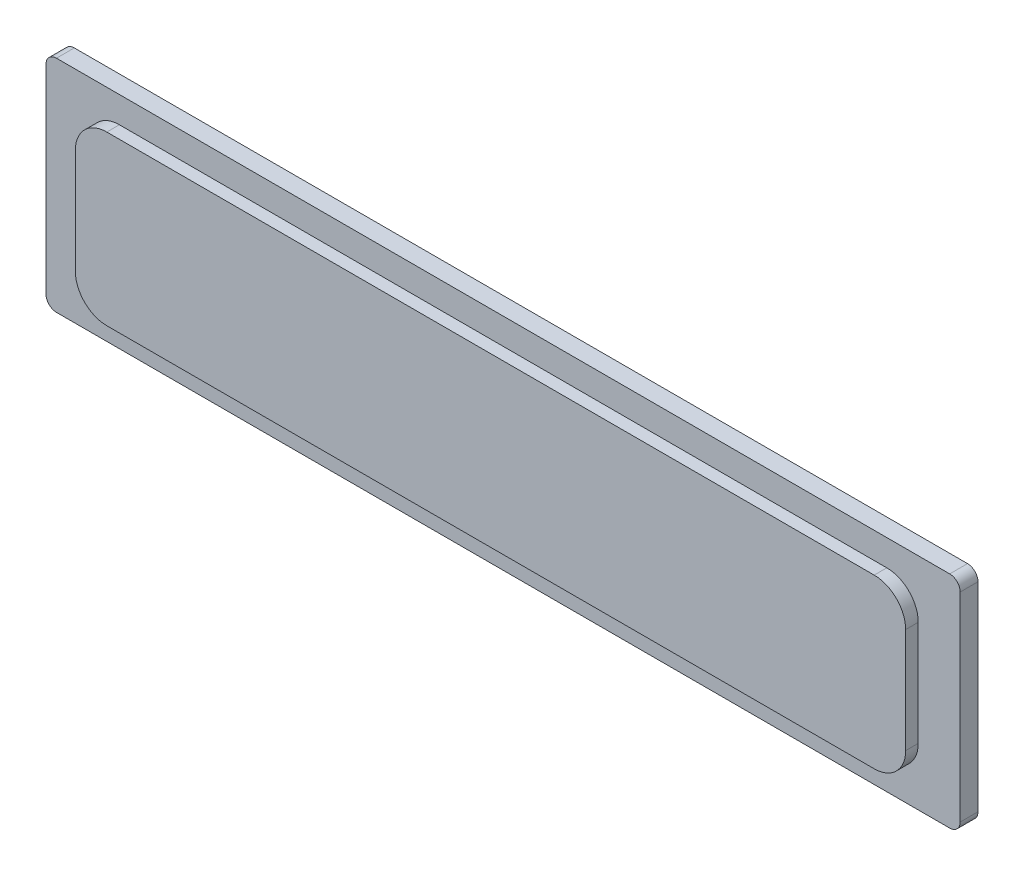
ISO-10303-21;
HEADER;
FILE_DESCRIPTION(('STEP AP214'),'2;1');
FILE_NAME('part.step','',(''),(''),'','','');
FILE_SCHEMA(('AUTOMOTIVE_DESIGN { 1 0 10303 214 1 1 1 1 }'));
ENDSEC;
DATA;
#1=APPLICATION_CONTEXT('core data for automotive mechanical design processes');
#2=APPLICATION_PROTOCOL_DEFINITION('international standard','automotive_design',2000,#1);
#3=PRODUCT_CONTEXT('',#1,'mechanical');
#4=PRODUCT('Part','Part','',(#3));
#5=PRODUCT_RELATED_PRODUCT_CATEGORY('part','',(#4));
#6=PRODUCT_DEFINITION_FORMATION('','',#4);
#7=PRODUCT_DEFINITION_CONTEXT('part definition',#1,'design');
#8=PRODUCT_DEFINITION('design','',#6,#7);
#9=PRODUCT_DEFINITION_SHAPE('','',#8);
#10=(LENGTH_UNIT() NAMED_UNIT(*) SI_UNIT(.MILLI.,.METRE.));
#11=(NAMED_UNIT(*) PLANE_ANGLE_UNIT() SI_UNIT($,.RADIAN.));
#12=(NAMED_UNIT(*) SI_UNIT($,.STERADIAN.) SOLID_ANGLE_UNIT());
#13=UNCERTAINTY_MEASURE_WITH_UNIT(LENGTH_MEASURE(1.E-05),#10,'distance_accuracy_value','');
#14=(GEOMETRIC_REPRESENTATION_CONTEXT(3) GLOBAL_UNCERTAINTY_ASSIGNED_CONTEXT((#13)) GLOBAL_UNIT_ASSIGNED_CONTEXT((#10,
#11,#12)) REPRESENTATION_CONTEXT('',''));
#15=CARTESIAN_POINT('',(0.,0.,0.));
#16=DIRECTION('',(0.,0.,1.));
#17=DIRECTION('',(1.,0.,0.));
#18=AXIS2_PLACEMENT_3D('',#15,#16,#17);
#19=CARTESIAN_POINT('',(43.6,10.5,1.7));
#20=DIRECTION('',(-1.,0.,0.));
#21=DIRECTION('',(0.,0.,1.));
#22=AXIS2_PLACEMENT_3D('',#19,#20,#21);
#23=PLANE('',#22);
#24=DIRECTION('',(0.,1.,0.));
#25=VECTOR('',#24,1.);
#26=CARTESIAN_POINT('',(43.6,10.5,1.7));
#27=LINE('',#26,#25);
#28=CARTESIAN_POINT('',(43.6,-9.49999999999999,1.7));
#29=VERTEX_POINT('',#28);
#30=CARTESIAN_POINT('',(43.6,9.5,1.7));
#31=VERTEX_POINT('',#30);
#32=EDGE_CURVE('E183',#29,#31,#27,.T.);
#33=ORIENTED_EDGE('',*,*,#32,.F.);
#34=DIRECTION('',(0.,0.,-1.));
#35=VECTOR('',#34,1.);
#36=CARTESIAN_POINT('',(43.6,-9.5,1.7));
#37=LINE('',#36,#35);
#38=CARTESIAN_POINT('',(43.6,-9.49999999999999,0.));
#39=VERTEX_POINT('',#38);
#40=EDGE_CURVE('E231',#29,#39,#37,.T.);
#41=ORIENTED_EDGE('',*,*,#40,.T.);
#42=DIRECTION('',(0.,1.,0.));
#43=VECTOR('',#42,1.);
#44=CARTESIAN_POINT('',(43.6,10.5,0.));
#45=LINE('',#44,#43);
#46=CARTESIAN_POINT('',(43.6,9.5,0.));
#47=VERTEX_POINT('',#46);
#48=EDGE_CURVE('E194',#39,#47,#45,.T.);
#49=ORIENTED_EDGE('',*,*,#48,.T.);
#50=DIRECTION('',(0.,0.,-1.));
#51=VECTOR('',#50,1.);
#52=CARTESIAN_POINT('',(43.6,9.5,1.7));
#53=LINE('',#52,#51);
#54=EDGE_CURVE('E229',#47,#31,#53,.F.);
#55=ORIENTED_EDGE('',*,*,#54,.T.);
#56=EDGE_LOOP('',(#33,#41,#49,#55));
#57=FACE_BOUND('',#56,.T.);
#58=ADVANCED_FACE('F33',(#57),#23,.F.);
#59=CARTESIAN_POINT('',(-43.6,10.5,1.7));
#60=DIRECTION('',(0.,-1.,0.));
#61=DIRECTION('',(0.,0.,-1.));
#62=AXIS2_PLACEMENT_3D('',#59,#60,#61);
#63=PLANE('',#62);
#64=DIRECTION('',(-1.,0.,0.));
#65=VECTOR('',#64,1.);
#66=CARTESIAN_POINT('',(-43.6,10.5,1.7));
#67=LINE('',#66,#65);
#68=CARTESIAN_POINT('',(42.6,10.5,1.7));
#69=VERTEX_POINT('',#68);
#70=CARTESIAN_POINT('',(-42.6,10.5,1.7));
#71=VERTEX_POINT('',#70);
#72=EDGE_CURVE('E186',#69,#71,#67,.T.);
#73=ORIENTED_EDGE('',*,*,#72,.F.);
#74=DIRECTION('',(0.,0.,-1.));
#75=VECTOR('',#74,1.);
#76=CARTESIAN_POINT('',(42.6,10.5,1.7));
#77=LINE('',#76,#75);
#78=CARTESIAN_POINT('',(42.6,10.5,0.));
#79=VERTEX_POINT('',#78);
#80=EDGE_CURVE('E256',#69,#79,#77,.T.);
#81=ORIENTED_EDGE('',*,*,#80,.T.);
#82=DIRECTION('',(-1.,0.,0.));
#83=VECTOR('',#82,1.);
#84=CARTESIAN_POINT('',(-43.6,10.5,0.));
#85=LINE('',#84,#83);
#86=CARTESIAN_POINT('',(-42.6,10.5,0.));
#87=VERTEX_POINT('',#86);
#88=EDGE_CURVE('E197',#79,#87,#85,.T.);
#89=ORIENTED_EDGE('',*,*,#88,.T.);
#90=DIRECTION('',(0.,0.,-1.));
#91=VECTOR('',#90,1.);
#92=CARTESIAN_POINT('',(-42.6,10.5,1.7));
#93=LINE('',#92,#91);
#94=EDGE_CURVE('E254',#87,#71,#93,.F.);
#95=ORIENTED_EDGE('',*,*,#94,.T.);
#96=EDGE_LOOP('',(#73,#81,#89,#95));
#97=FACE_BOUND('',#96,.T.);
#98=ADVANCED_FACE('F289',(#97),#63,.F.);
#99=CARTESIAN_POINT('',(-43.6,10.5,1.7));
#100=DIRECTION('',(1.,0.,0.));
#101=DIRECTION('',(0.,0.,-1.));
#102=AXIS2_PLACEMENT_3D('',#99,#100,#101);
#103=PLANE('',#102);
#104=DIRECTION('',(0.,-1.,0.));
#105=VECTOR('',#104,1.);
#106=CARTESIAN_POINT('',(-43.6,10.5,0.));
#107=LINE('',#106,#105);
#108=CARTESIAN_POINT('',(-43.6,9.5,0.));
#109=VERTEX_POINT('',#108);
#110=CARTESIAN_POINT('',(-43.6,-9.49999999999999,0.));
#111=VERTEX_POINT('',#110);
#112=EDGE_CURVE('E200',#109,#111,#107,.T.);
#113=ORIENTED_EDGE('',*,*,#112,.T.);
#114=DIRECTION('',(0.,0.,-1.));
#115=VECTOR('',#114,1.);
#116=CARTESIAN_POINT('',(-43.6,-9.5,1.7));
#117=LINE('',#116,#115);
#118=CARTESIAN_POINT('',(-43.6,-9.49999999999999,1.7));
#119=VERTEX_POINT('',#118);
#120=EDGE_CURVE('E11',#111,#119,#117,.F.);
#121=ORIENTED_EDGE('',*,*,#120,.T.);
#122=DIRECTION('',(0.,-1.,0.));
#123=VECTOR('',#122,1.);
#124=CARTESIAN_POINT('',(-43.6,10.5,1.7));
#125=LINE('',#124,#123);
#126=CARTESIAN_POINT('',(-43.6,9.5,1.7));
#127=VERTEX_POINT('',#126);
#128=EDGE_CURVE('E189',#127,#119,#125,.T.);
#129=ORIENTED_EDGE('',*,*,#128,.F.);
#130=DIRECTION('',(0.,0.,-1.));
#131=VECTOR('',#130,1.);
#132=CARTESIAN_POINT('',(-43.6,9.5,1.7));
#133=LINE('',#132,#131);
#134=EDGE_CURVE('E41',#127,#109,#133,.T.);
#135=ORIENTED_EDGE('',*,*,#134,.T.);
#136=EDGE_LOOP('',(#113,#121,#129,#135));
#137=FACE_BOUND('',#136,.T.);
#138=ADVANCED_FACE('F261',(#137),#103,.F.);
#139=CARTESIAN_POINT('',(-43.6,-10.5,1.7));
#140=DIRECTION('',(0.,1.,0.));
#141=DIRECTION('',(0.,0.,1.));
#142=AXIS2_PLACEMENT_3D('',#139,#140,#141);
#143=PLANE('',#142);
#144=DIRECTION('',(1.,0.,0.));
#145=VECTOR('',#144,1.);
#146=CARTESIAN_POINT('',(-43.6,-10.5,0.));
#147=LINE('',#146,#145);
#148=CARTESIAN_POINT('',(-42.6,-10.5,0.));
#149=VERTEX_POINT('',#148);
#150=CARTESIAN_POINT('',(42.6,-10.5,0.));
#151=VERTEX_POINT('',#150);
#152=EDGE_CURVE('E187',#149,#151,#147,.T.);
#153=ORIENTED_EDGE('',*,*,#152,.T.);
#154=DIRECTION('',(0.,0.,-1.));
#155=VECTOR('',#154,1.);
#156=CARTESIAN_POINT('',(42.6,-10.5,1.7));
#157=LINE('',#156,#155);
#158=CARTESIAN_POINT('',(42.6,-10.5,1.7));
#159=VERTEX_POINT('',#158);
#160=EDGE_CURVE('E245',#151,#159,#157,.F.);
#161=ORIENTED_EDGE('',*,*,#160,.T.);
#162=DIRECTION('',(1.,0.,0.));
#163=VECTOR('',#162,1.);
#164=CARTESIAN_POINT('',(-43.6,-10.5,1.7));
#165=LINE('',#164,#163);
#166=CARTESIAN_POINT('',(-42.6,-10.5,1.7));
#167=VERTEX_POINT('',#166);
#168=EDGE_CURVE('E191',#167,#159,#165,.T.);
#169=ORIENTED_EDGE('',*,*,#168,.F.);
#170=DIRECTION('',(0.,0.,-1.));
#171=VECTOR('',#170,1.);
#172=CARTESIAN_POINT('',(-42.6,-10.5,1.7));
#173=LINE('',#172,#171);
#174=EDGE_CURVE('E242',#167,#149,#173,.T.);
#175=ORIENTED_EDGE('',*,*,#174,.T.);
#176=EDGE_LOOP('',(#153,#161,#169,#175));
#177=FACE_BOUND('',#176,.T.);
#178=ADVANCED_FACE('F274',(#177),#143,.F.);
#179=CARTESIAN_POINT('',(0.,0.,1.7));
#180=DIRECTION('',(0.,0.,1.));
#181=DIRECTION('',(1.,0.,0.));
#182=AXIS2_PLACEMENT_3D('',#179,#180,#181);
#183=PLANE('',#182);
#184=DIRECTION('',(0.,1.,0.));
#185=VECTOR('',#184,1.);
#186=CARTESIAN_POINT('',(39.6,8.,1.7));
#187=LINE('',#186,#185);
#188=CARTESIAN_POINT('',(39.6,-5.,1.7));
#189=VERTEX_POINT('',#188);
#190=CARTESIAN_POINT('',(39.6,5.,1.7));
#191=VERTEX_POINT('',#190);
#192=EDGE_CURVE('E456',#189,#191,#187,.T.);
#193=ORIENTED_EDGE('',*,*,#192,.F.);
#194=CARTESIAN_POINT('',(36.6,-5.,1.7));
#195=DIRECTION('',(0.,0.,1.));
#196=DIRECTION('',(1.,0.,0.));
#197=AXIS2_PLACEMENT_3D('',#194,#195,#196);
#198=CIRCLE('',#197,3.);
#199=CARTESIAN_POINT('',(36.6,-8.,1.7));
#200=VERTEX_POINT('',#199);
#201=EDGE_CURVE('E172',#189,#200,#198,.F.);
#202=ORIENTED_EDGE('',*,*,#201,.T.);
#203=DIRECTION('',(1.,0.,0.));
#204=VECTOR('',#203,1.);
#205=CARTESIAN_POINT('',(-39.6,-8.,1.7));
#206=LINE('',#205,#204);
#207=CARTESIAN_POINT('',(-36.6,-8.,1.7));
#208=VERTEX_POINT('',#207);
#209=EDGE_CURVE('E163',#208,#200,#206,.T.);
#210=ORIENTED_EDGE('',*,*,#209,.F.);
#211=CARTESIAN_POINT('',(-36.6,-5.,1.7));
#212=DIRECTION('',(0.,0.,1.));
#213=DIRECTION('',(1.,0.,0.));
#214=AXIS2_PLACEMENT_3D('',#211,#212,#213);
#215=CIRCLE('',#214,3.);
#216=CARTESIAN_POINT('',(-39.6,-5.,1.7));
#217=VERTEX_POINT('',#216);
#218=EDGE_CURVE('E146',#208,#217,#215,.F.);
#219=ORIENTED_EDGE('',*,*,#218,.T.);
#220=DIRECTION('',(0.,-1.,0.));
#221=VECTOR('',#220,1.);
#222=CARTESIAN_POINT('',(-39.6,8.,1.7));
#223=LINE('',#222,#221);
#224=CARTESIAN_POINT('',(-39.6,5.,1.7));
#225=VERTEX_POINT('',#224);
#226=EDGE_CURVE('E174',#225,#217,#223,.T.);
#227=ORIENTED_EDGE('',*,*,#226,.F.);
#228=CARTESIAN_POINT('',(-36.6,5.,1.7));
#229=DIRECTION('',(0.,0.,1.));
#230=DIRECTION('',(1.,0.,0.));
#231=AXIS2_PLACEMENT_3D('',#228,#229,#230);
#232=CIRCLE('',#231,3.);
#233=CARTESIAN_POINT('',(-36.6,8.,1.7));
#234=VERTEX_POINT('',#233);
#235=EDGE_CURVE('E156',#225,#234,#232,.F.);
#236=ORIENTED_EDGE('',*,*,#235,.T.);
#237=DIRECTION('',(-1.,0.,0.));
#238=VECTOR('',#237,1.);
#239=CARTESIAN_POINT('',(-39.6,8.,1.7));
#240=LINE('',#239,#238);
#241=CARTESIAN_POINT('',(36.6,8.,1.7));
#242=VERTEX_POINT('',#241);
#243=EDGE_CURVE('E179',#242,#234,#240,.T.);
#244=ORIENTED_EDGE('',*,*,#243,.F.);
#245=CARTESIAN_POINT('',(36.6,5.,1.7));
#246=DIRECTION('',(0.,0.,1.));
#247=DIRECTION('',(1.,0.,0.));
#248=AXIS2_PLACEMENT_3D('',#245,#246,#247);
#249=CIRCLE('',#248,3.);
#250=EDGE_CURVE('E226',#242,#191,#249,.F.);
#251=ORIENTED_EDGE('',*,*,#250,.T.);
#252=EDGE_LOOP('',(#193,#202,#210,#219,#227,#236,#244,#251));
#253=FACE_BOUND('',#252,.T.);
#254=ORIENTED_EDGE('',*,*,#168,.T.);
#255=CARTESIAN_POINT('',(42.6,-9.5,1.7));
#256=DIRECTION('',(0.,0.,1.));
#257=DIRECTION('',(1.,0.,0.));
#258=AXIS2_PLACEMENT_3D('',#255,#256,#257);
#259=CIRCLE('',#258,1.);
#260=EDGE_CURVE('E252',#159,#29,#259,.T.);
#261=ORIENTED_EDGE('',*,*,#260,.T.);
#262=ORIENTED_EDGE('',*,*,#32,.T.);
#263=CARTESIAN_POINT('',(42.6,9.5,1.7));
#264=DIRECTION('',(0.,0.,1.));
#265=DIRECTION('',(1.,0.,0.));
#266=AXIS2_PLACEMENT_3D('',#263,#264,#265);
#267=CIRCLE('',#266,1.);
#268=EDGE_CURVE('E250',#31,#69,#267,.T.);
#269=ORIENTED_EDGE('',*,*,#268,.T.);
#270=ORIENTED_EDGE('',*,*,#72,.T.);
#271=CARTESIAN_POINT('',(-42.6,9.5,1.7));
#272=DIRECTION('',(0.,0.,1.));
#273=DIRECTION('',(1.,0.,0.));
#274=AXIS2_PLACEMENT_3D('',#271,#272,#273);
#275=CIRCLE('',#274,1.);
#276=EDGE_CURVE('E53',#71,#127,#275,.T.);
#277=ORIENTED_EDGE('',*,*,#276,.T.);
#278=ORIENTED_EDGE('',*,*,#128,.T.);
#279=CARTESIAN_POINT('',(-42.6,-9.5,1.7));
#280=DIRECTION('',(0.,0.,1.));
#281=DIRECTION('',(1.,0.,0.));
#282=AXIS2_PLACEMENT_3D('',#279,#280,#281);
#283=CIRCLE('',#282,1.);
#284=EDGE_CURVE('E248',#119,#167,#283,.T.);
#285=ORIENTED_EDGE('',*,*,#284,.T.);
#286=EDGE_LOOP('',(#254,#261,#262,#269,#270,#277,#278,#285));
#287=FACE_BOUND('',#286,.T.);
#288=ADVANCED_FACE('F171',(#253,#287),#183,.T.);
#289=CARTESIAN_POINT('',(0.,0.,0.));
#290=DIRECTION('',(0.,0.,1.));
#291=DIRECTION('',(1.,0.,0.));
#292=AXIS2_PLACEMENT_3D('',#289,#290,#291);
#293=PLANE('',#292);
#294=ORIENTED_EDGE('',*,*,#48,.F.);
#295=CARTESIAN_POINT('',(42.6,-9.5,0.));
#296=DIRECTION('',(0.,0.,1.));
#297=DIRECTION('',(1.,0.,0.));
#298=AXIS2_PLACEMENT_3D('',#295,#296,#297);
#299=CIRCLE('',#298,1.);
#300=EDGE_CURVE('E240',#39,#151,#299,.F.);
#301=ORIENTED_EDGE('',*,*,#300,.T.);
#302=ORIENTED_EDGE('',*,*,#152,.F.);
#303=CARTESIAN_POINT('',(-42.6,-9.5,0.));
#304=DIRECTION('',(0.,0.,1.));
#305=DIRECTION('',(1.,0.,0.));
#306=AXIS2_PLACEMENT_3D('',#303,#304,#305);
#307=CIRCLE('',#306,1.);
#308=EDGE_CURVE('E236',#149,#111,#307,.F.);
#309=ORIENTED_EDGE('',*,*,#308,.T.);
#310=ORIENTED_EDGE('',*,*,#112,.F.);
#311=CARTESIAN_POINT('',(-42.6,9.5,0.));
#312=DIRECTION('',(0.,0.,1.));
#313=DIRECTION('',(1.,0.,0.));
#314=AXIS2_PLACEMENT_3D('',#311,#312,#313);
#315=CIRCLE('',#314,1.);
#316=EDGE_CURVE('E234',#109,#87,#315,.F.);
#317=ORIENTED_EDGE('',*,*,#316,.T.);
#318=ORIENTED_EDGE('',*,*,#88,.F.);
#319=CARTESIAN_POINT('',(42.6,9.5,0.));
#320=DIRECTION('',(0.,0.,1.));
#321=DIRECTION('',(1.,0.,0.));
#322=AXIS2_PLACEMENT_3D('',#319,#320,#321);
#323=CIRCLE('',#322,1.);
#324=EDGE_CURVE('E238',#79,#47,#323,.F.);
#325=ORIENTED_EDGE('',*,*,#324,.T.);
#326=EDGE_LOOP('',(#294,#301,#302,#309,#310,#317,#318,#325));
#327=FACE_BOUND('',#326,.T.);
#328=ADVANCED_FACE('F265',(#327),#293,.F.);
#329=CARTESIAN_POINT('',(39.6,8.,2.9));
#330=DIRECTION('',(-1.,0.,0.));
#331=DIRECTION('',(0.,0.,1.));
#332=AXIS2_PLACEMENT_3D('',#329,#330,#331);
#333=PLANE('',#332);
#334=ORIENTED_EDGE('',*,*,#192,.T.);
#335=DIRECTION('',(0.,0.,-1.));
#336=VECTOR('',#335,1.);
#337=CARTESIAN_POINT('',(39.6,5.,2.9));
#338=LINE('',#337,#336);
#339=CARTESIAN_POINT('',(39.6,5.,2.9));
#340=VERTEX_POINT('',#339);
#341=EDGE_CURVE('E157',#191,#340,#338,.F.);
#342=ORIENTED_EDGE('',*,*,#341,.T.);
#343=DIRECTION('',(0.,1.,0.));
#344=VECTOR('',#343,1.);
#345=CARTESIAN_POINT('',(39.6,8.,2.9));
#346=LINE('',#345,#344);
#347=CARTESIAN_POINT('',(39.6,-5.,2.9));
#348=VERTEX_POINT('',#347);
#349=EDGE_CURVE('E173',#348,#340,#346,.T.);
#350=ORIENTED_EDGE('',*,*,#349,.F.);
#351=DIRECTION('',(0.,0.,-1.));
#352=VECTOR('',#351,1.);
#353=CARTESIAN_POINT('',(39.6,-5.,2.9));
#354=LINE('',#353,#352);
#355=EDGE_CURVE('E221',#348,#189,#354,.T.);
#356=ORIENTED_EDGE('',*,*,#355,.T.);
#357=EDGE_LOOP('',(#334,#342,#350,#356));
#358=FACE_BOUND('',#357,.T.);
#359=ADVANCED_FACE('F395',(#358),#333,.F.);
#360=CARTESIAN_POINT('',(-39.6,8.,2.9));
#361=DIRECTION('',(0.,-1.,0.));
#362=DIRECTION('',(0.,0.,-1.));
#363=AXIS2_PLACEMENT_3D('',#360,#361,#362);
#364=PLANE('',#363);
#365=ORIENTED_EDGE('',*,*,#243,.T.);
#366=DIRECTION('',(0.,0.,-1.));
#367=VECTOR('',#366,1.);
#368=CARTESIAN_POINT('',(-36.6,8.,2.9));
#369=LINE('',#368,#367);
#370=CARTESIAN_POINT('',(-36.6,8.,2.9));
#371=VERTEX_POINT('',#370);
#372=EDGE_CURVE('E219',#234,#371,#369,.F.);
#373=ORIENTED_EDGE('',*,*,#372,.T.);
#374=DIRECTION('',(-1.,0.,0.));
#375=VECTOR('',#374,1.);
#376=CARTESIAN_POINT('',(-39.6,8.,2.9));
#377=LINE('',#376,#375);
#378=CARTESIAN_POINT('',(36.6,8.,2.9));
#379=VERTEX_POINT('',#378);
#380=EDGE_CURVE('E177',#379,#371,#377,.T.);
#381=ORIENTED_EDGE('',*,*,#380,.F.);
#382=DIRECTION('',(0.,0.,-1.));
#383=VECTOR('',#382,1.);
#384=CARTESIAN_POINT('',(36.6,8.,2.9));
#385=LINE('',#384,#383);
#386=EDGE_CURVE('E216',#379,#242,#385,.T.);
#387=ORIENTED_EDGE('',*,*,#386,.T.);
#388=EDGE_LOOP('',(#365,#373,#381,#387));
#389=FACE_BOUND('',#388,.T.);
#390=ADVANCED_FACE('F386',(#389),#364,.F.);
#391=CARTESIAN_POINT('',(-39.6,8.,2.9));
#392=DIRECTION('',(1.,0.,0.));
#393=DIRECTION('',(0.,0.,-1.));
#394=AXIS2_PLACEMENT_3D('',#391,#392,#393);
#395=PLANE('',#394);
#396=ORIENTED_EDGE('',*,*,#226,.T.);
#397=DIRECTION('',(0.,0.,-1.));
#398=VECTOR('',#397,1.);
#399=CARTESIAN_POINT('',(-39.6,-5.,2.9));
#400=LINE('',#399,#398);
#401=CARTESIAN_POINT('',(-39.6,-5.,2.9));
#402=VERTEX_POINT('',#401);
#403=EDGE_CURVE('E151',#217,#402,#400,.F.);
#404=ORIENTED_EDGE('',*,*,#403,.T.);
#405=DIRECTION('',(0.,-1.,0.));
#406=VECTOR('',#405,1.);
#407=CARTESIAN_POINT('',(-39.6,8.,2.9));
#408=LINE('',#407,#406);
#409=CARTESIAN_POINT('',(-39.6,5.,2.9));
#410=VERTEX_POINT('',#409);
#411=EDGE_CURVE('E470',#410,#402,#408,.T.);
#412=ORIENTED_EDGE('',*,*,#411,.F.);
#413=DIRECTION('',(0.,0.,-1.));
#414=VECTOR('',#413,1.);
#415=CARTESIAN_POINT('',(-39.6,5.,2.9));
#416=LINE('',#415,#414);
#417=EDGE_CURVE('E167',#410,#225,#416,.T.);
#418=ORIENTED_EDGE('',*,*,#417,.T.);
#419=EDGE_LOOP('',(#396,#404,#412,#418));
#420=FACE_BOUND('',#419,.T.);
#421=ADVANCED_FACE('F378',(#420),#395,.F.);
#422=CARTESIAN_POINT('',(-39.6,-8.,2.9));
#423=DIRECTION('',(0.,1.,0.));
#424=DIRECTION('',(0.,0.,1.));
#425=AXIS2_PLACEMENT_3D('',#422,#423,#424);
#426=PLANE('',#425);
#427=DIRECTION('',(1.,0.,0.));
#428=VECTOR('',#427,1.);
#429=CARTESIAN_POINT('',(-39.6,-8.,2.9));
#430=LINE('',#429,#428);
#431=CARTESIAN_POINT('',(-36.6,-8.,2.9));
#432=VERTEX_POINT('',#431);
#433=CARTESIAN_POINT('',(36.6,-8.,2.9));
#434=VERTEX_POINT('',#433);
#435=EDGE_CURVE('E166',#432,#434,#430,.T.);
#436=ORIENTED_EDGE('',*,*,#435,.F.);
#437=DIRECTION('',(0.,0.,-1.));
#438=VECTOR('',#437,1.);
#439=CARTESIAN_POINT('',(-36.6,-8.,2.9));
#440=LINE('',#439,#438);
#441=EDGE_CURVE('E150',#432,#208,#440,.T.);
#442=ORIENTED_EDGE('',*,*,#441,.T.);
#443=ORIENTED_EDGE('',*,*,#209,.T.);
#444=DIRECTION('',(0.,0.,-1.));
#445=VECTOR('',#444,1.);
#446=CARTESIAN_POINT('',(36.6,-8.,2.9));
#447=LINE('',#446,#445);
#448=EDGE_CURVE('E168',#200,#434,#447,.F.);
#449=ORIENTED_EDGE('',*,*,#448,.T.);
#450=EDGE_LOOP('',(#436,#442,#443,#449));
#451=FACE_BOUND('',#450,.T.);
#452=ADVANCED_FACE('F162',(#451),#426,.F.);
#453=CARTESIAN_POINT('',(0.,0.,2.9));
#454=DIRECTION('',(0.,0.,1.));
#455=DIRECTION('',(1.,0.,0.));
#456=AXIS2_PLACEMENT_3D('',#453,#454,#455);
#457=PLANE('',#456);
#458=ORIENTED_EDGE('',*,*,#411,.T.);
#459=CARTESIAN_POINT('',(-36.6,-5.,2.9));
#460=DIRECTION('',(0.,0.,1.));
#461=DIRECTION('',(1.,0.,0.));
#462=AXIS2_PLACEMENT_3D('',#459,#460,#461);
#463=CIRCLE('',#462,3.);
#464=EDGE_CURVE('E214',#402,#432,#463,.T.);
#465=ORIENTED_EDGE('',*,*,#464,.T.);
#466=ORIENTED_EDGE('',*,*,#435,.T.);
#467=CARTESIAN_POINT('',(36.6,-5.,2.9));
#468=DIRECTION('',(0.,0.,1.));
#469=DIRECTION('',(1.,0.,0.));
#470=AXIS2_PLACEMENT_3D('',#467,#468,#469);
#471=CIRCLE('',#470,3.);
#472=EDGE_CURVE('E208',#434,#348,#471,.T.);
#473=ORIENTED_EDGE('',*,*,#472,.T.);
#474=ORIENTED_EDGE('',*,*,#349,.T.);
#475=CARTESIAN_POINT('',(36.6,5.,2.9));
#476=DIRECTION('',(0.,0.,1.));
#477=DIRECTION('',(1.,0.,0.));
#478=AXIS2_PLACEMENT_3D('',#475,#476,#477);
#479=CIRCLE('',#478,3.);
#480=EDGE_CURVE('E210',#340,#379,#479,.T.);
#481=ORIENTED_EDGE('',*,*,#480,.T.);
#482=ORIENTED_EDGE('',*,*,#380,.T.);
#483=CARTESIAN_POINT('',(-36.6,5.,2.9));
#484=DIRECTION('',(0.,0.,1.));
#485=DIRECTION('',(1.,0.,0.));
#486=AXIS2_PLACEMENT_3D('',#483,#484,#485);
#487=CIRCLE('',#486,3.);
#488=EDGE_CURVE('E212',#371,#410,#487,.T.);
#489=ORIENTED_EDGE('',*,*,#488,.T.);
#490=EDGE_LOOP('',(#458,#465,#466,#473,#474,#481,#482,#489));
#491=FACE_BOUND('',#490,.T.);
#492=ADVANCED_FACE('F306',(#491),#457,.T.);
#493=CARTESIAN_POINT('',(-36.6,-5.,2.9));
#494=DIRECTION('',(0.,0.,-1.));
#495=DIRECTION('',(-1.,0.,0.));
#496=AXIS2_PLACEMENT_3D('',#493,#494,#495);
#497=CYLINDRICAL_SURFACE('',#496,3.);
#498=ORIENTED_EDGE('',*,*,#464,.F.);
#499=ORIENTED_EDGE('',*,*,#403,.F.);
#500=ORIENTED_EDGE('',*,*,#218,.F.);
#501=ORIENTED_EDGE('',*,*,#441,.F.);
#502=EDGE_LOOP('',(#498,#499,#500,#501));
#503=FACE_BOUND('',#502,.T.);
#504=ADVANCED_FACE('F149',(#503),#497,.T.);
#505=CARTESIAN_POINT('',(-36.6,5.,2.9));
#506=DIRECTION('',(0.,0.,-1.));
#507=DIRECTION('',(-1.,0.,0.));
#508=AXIS2_PLACEMENT_3D('',#505,#506,#507);
#509=CYLINDRICAL_SURFACE('',#508,3.);
#510=ORIENTED_EDGE('',*,*,#488,.F.);
#511=ORIENTED_EDGE('',*,*,#372,.F.);
#512=ORIENTED_EDGE('',*,*,#235,.F.);
#513=ORIENTED_EDGE('',*,*,#417,.F.);
#514=EDGE_LOOP('',(#510,#511,#512,#513));
#515=FACE_BOUND('',#514,.T.);
#516=ADVANCED_FACE('F305',(#515),#509,.T.);
#517=CARTESIAN_POINT('',(36.6,5.,2.9));
#518=DIRECTION('',(0.,0.,-1.));
#519=DIRECTION('',(-1.,0.,0.));
#520=AXIS2_PLACEMENT_3D('',#517,#518,#519);
#521=CYLINDRICAL_SURFACE('',#520,3.);
#522=ORIENTED_EDGE('',*,*,#480,.F.);
#523=ORIENTED_EDGE('',*,*,#341,.F.);
#524=ORIENTED_EDGE('',*,*,#250,.F.);
#525=ORIENTED_EDGE('',*,*,#386,.F.);
#526=EDGE_LOOP('',(#522,#523,#524,#525));
#527=FACE_BOUND('',#526,.T.);
#528=ADVANCED_FACE('F309',(#527),#521,.T.);
#529=CARTESIAN_POINT('',(36.6,-5.,2.9));
#530=DIRECTION('',(0.,0.,-1.));
#531=DIRECTION('',(-1.,0.,0.));
#532=AXIS2_PLACEMENT_3D('',#529,#530,#531);
#533=CYLINDRICAL_SURFACE('',#532,3.);
#534=ORIENTED_EDGE('',*,*,#472,.F.);
#535=ORIENTED_EDGE('',*,*,#448,.F.);
#536=ORIENTED_EDGE('',*,*,#201,.F.);
#537=ORIENTED_EDGE('',*,*,#355,.F.);
#538=EDGE_LOOP('',(#534,#535,#536,#537));
#539=FACE_BOUND('',#538,.T.);
#540=ADVANCED_FACE('F313',(#539),#533,.T.);
#541=CARTESIAN_POINT('',(42.6,-9.5,1.7));
#542=DIRECTION('',(0.,0.,-1.));
#543=DIRECTION('',(-1.,0.,0.));
#544=AXIS2_PLACEMENT_3D('',#541,#542,#543);
#545=CYLINDRICAL_SURFACE('',#544,1.);
#546=ORIENTED_EDGE('',*,*,#260,.F.);
#547=ORIENTED_EDGE('',*,*,#160,.F.);
#548=ORIENTED_EDGE('',*,*,#300,.F.);
#549=ORIENTED_EDGE('',*,*,#40,.F.);
#550=EDGE_LOOP('',(#546,#547,#548,#549));
#551=FACE_BOUND('',#550,.T.);
#552=ADVANCED_FACE('F280',(#551),#545,.T.);
#553=CARTESIAN_POINT('',(42.6,9.5,1.7));
#554=DIRECTION('',(0.,0.,-1.));
#555=DIRECTION('',(-1.,0.,0.));
#556=AXIS2_PLACEMENT_3D('',#553,#554,#555);
#557=CYLINDRICAL_SURFACE('',#556,1.);
#558=ORIENTED_EDGE('',*,*,#268,.F.);
#559=ORIENTED_EDGE('',*,*,#54,.F.);
#560=ORIENTED_EDGE('',*,*,#324,.F.);
#561=ORIENTED_EDGE('',*,*,#80,.F.);
#562=EDGE_LOOP('',(#558,#559,#560,#561));
#563=FACE_BOUND('',#562,.T.);
#564=ADVANCED_FACE('F286',(#563),#557,.T.);
#565=CARTESIAN_POINT('',(-42.6,-9.5,1.7));
#566=DIRECTION('',(0.,0.,-1.));
#567=DIRECTION('',(-1.,0.,0.));
#568=AXIS2_PLACEMENT_3D('',#565,#566,#567);
#569=CYLINDRICAL_SURFACE('',#568,1.);
#570=ORIENTED_EDGE('',*,*,#284,.F.);
#571=ORIENTED_EDGE('',*,*,#120,.F.);
#572=ORIENTED_EDGE('',*,*,#308,.F.);
#573=ORIENTED_EDGE('',*,*,#174,.F.);
#574=EDGE_LOOP('',(#570,#571,#572,#573));
#575=FACE_BOUND('',#574,.T.);
#576=ADVANCED_FACE('F271',(#575),#569,.T.);
#577=CARTESIAN_POINT('',(-42.6,9.5,1.7));
#578=DIRECTION('',(0.,0.,-1.));
#579=DIRECTION('',(-1.,0.,0.));
#580=AXIS2_PLACEMENT_3D('',#577,#578,#579);
#581=CYLINDRICAL_SURFACE('',#580,1.);
#582=ORIENTED_EDGE('',*,*,#276,.F.);
#583=ORIENTED_EDGE('',*,*,#94,.F.);
#584=ORIENTED_EDGE('',*,*,#316,.F.);
#585=ORIENTED_EDGE('',*,*,#134,.F.);
#586=EDGE_LOOP('',(#582,#583,#584,#585));
#587=FACE_BOUND('',#586,.T.);
#588=ADVANCED_FACE('F35',(#587),#581,.T.);
#589=CLOSED_SHELL('',(#58,#98,#138,#178,#288,#328,#359,#390,#421,#452,#492,#504,#516,#528,#540,
#552,#564,#576,#588));
#590=MANIFOLD_SOLID_BREP('B2',#589);
#591=ADVANCED_BREP_SHAPE_REPRESENTATION('',(#18,#590),#14);
#592=SHAPE_DEFINITION_REPRESENTATION(#9,#591);
ENDSEC;
END-ISO-10303-21;
